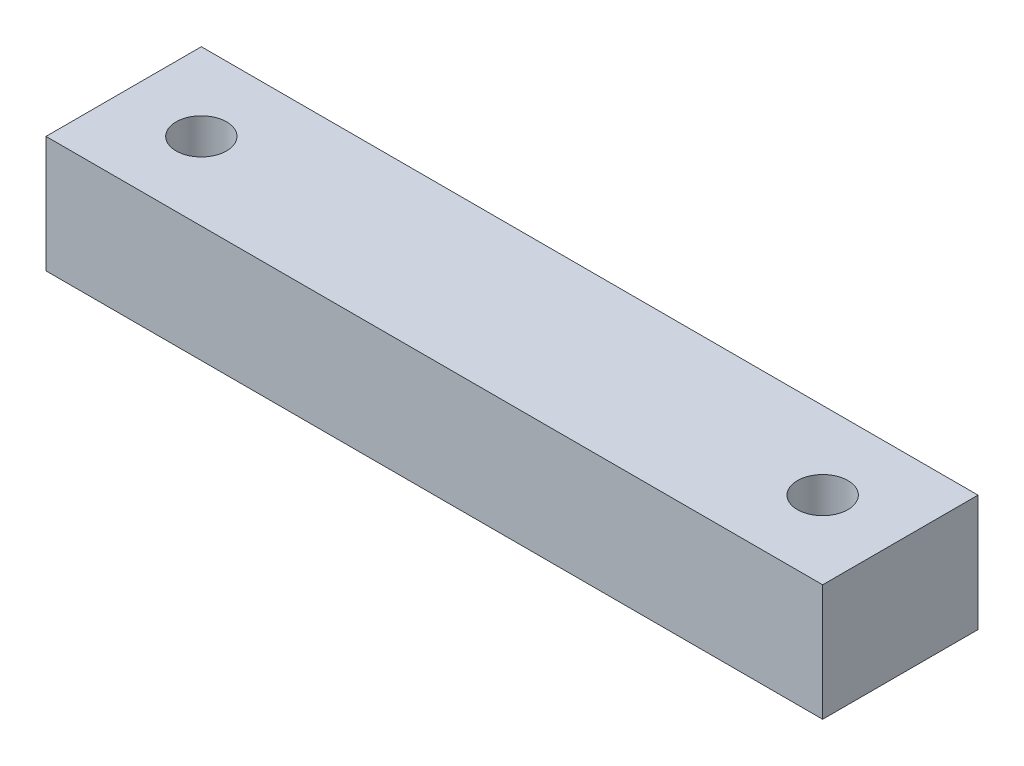
ISO-10303-21;
HEADER;
FILE_DESCRIPTION(('STEP AP214'),'2;1');
FILE_NAME('part.step','',(''),(''),'','','');
FILE_SCHEMA(('AUTOMOTIVE_DESIGN { 1 0 10303 214 1 1 1 1 }'));
ENDSEC;
DATA;
#1=APPLICATION_CONTEXT('core data for automotive mechanical design processes');
#2=APPLICATION_PROTOCOL_DEFINITION('international standard','automotive_design',2000,#1);
#3=PRODUCT_CONTEXT('',#1,'mechanical');
#4=PRODUCT('Part','Part','',(#3));
#5=PRODUCT_RELATED_PRODUCT_CATEGORY('part','',(#4));
#6=PRODUCT_DEFINITION_FORMATION('','',#4);
#7=PRODUCT_DEFINITION_CONTEXT('part definition',#1,'design');
#8=PRODUCT_DEFINITION('design','',#6,#7);
#9=PRODUCT_DEFINITION_SHAPE('','',#8);
#10=(LENGTH_UNIT() NAMED_UNIT(*) SI_UNIT(.MILLI.,.METRE.));
#11=(NAMED_UNIT(*) PLANE_ANGLE_UNIT() SI_UNIT($,.RADIAN.));
#12=(NAMED_UNIT(*) SI_UNIT($,.STERADIAN.) SOLID_ANGLE_UNIT());
#13=UNCERTAINTY_MEASURE_WITH_UNIT(LENGTH_MEASURE(1.E-05),#10,'distance_accuracy_value','');
#14=(GEOMETRIC_REPRESENTATION_CONTEXT(3) GLOBAL_UNCERTAINTY_ASSIGNED_CONTEXT((#13)) GLOBAL_UNIT_ASSIGNED_CONTEXT((#10,
#11,#12)) REPRESENTATION_CONTEXT('',''));
#15=CARTESIAN_POINT('',(0.,0.,0.));
#16=DIRECTION('',(0.,0.,1.));
#17=DIRECTION('',(1.,0.,0.));
#18=AXIS2_PLACEMENT_3D('',#15,#16,#17);
#19=CARTESIAN_POINT('',(0.,15.,0.));
#20=DIRECTION('',(1.,0.,0.));
#21=DIRECTION('',(0.,0.,-1.));
#22=AXIS2_PLACEMENT_3D('',#19,#20,#21);
#23=PLANE('',#22);
#24=DIRECTION('',(0.,0.,1.));
#25=VECTOR('',#24,1.);
#26=CARTESIAN_POINT('',(0.,0.,0.));
#27=LINE('',#26,#25);
#28=CARTESIAN_POINT('',(0.,0.,-20.));
#29=VERTEX_POINT('',#28);
#30=CARTESIAN_POINT('',(0.,0.,0.));
#31=VERTEX_POINT('',#30);
#32=EDGE_CURVE('E94',#29,#31,#27,.T.);
#33=ORIENTED_EDGE('',*,*,#32,.T.);
#34=DIRECTION('',(0.,-1.,0.));
#35=VECTOR('',#34,1.);
#36=CARTESIAN_POINT('',(0.,15.,0.));
#37=LINE('',#36,#35);
#38=CARTESIAN_POINT('',(0.,15.,0.));
#39=VERTEX_POINT('',#38);
#40=EDGE_CURVE('E11',#39,#31,#37,.T.);
#41=ORIENTED_EDGE('',*,*,#40,.F.);
#42=DIRECTION('',(0.,0.,1.));
#43=VECTOR('',#42,1.);
#44=CARTESIAN_POINT('',(0.,15.,0.));
#45=LINE('',#44,#43);
#46=CARTESIAN_POINT('',(0.,15.,-20.));
#47=VERTEX_POINT('',#46);
#48=EDGE_CURVE('E82',#47,#39,#45,.T.);
#49=ORIENTED_EDGE('',*,*,#48,.F.);
#50=DIRECTION('',(0.,-1.,0.));
#51=VECTOR('',#50,1.);
#52=CARTESIAN_POINT('',(0.,15.,-20.));
#53=LINE('',#52,#51);
#54=EDGE_CURVE('E90',#47,#29,#53,.T.);
#55=ORIENTED_EDGE('',*,*,#54,.T.);
#56=EDGE_LOOP('',(#33,#41,#49,#55));
#57=FACE_BOUND('',#56,.T.);
#58=ADVANCED_FACE('F31',(#57),#23,.F.);
#59=CARTESIAN_POINT('',(0.,15.,0.));
#60=DIRECTION('',(0.,0.,-1.));
#61=DIRECTION('',(-1.,0.,0.));
#62=AXIS2_PLACEMENT_3D('',#59,#60,#61);
#63=PLANE('',#62);
#64=DIRECTION('',(1.,0.,0.));
#65=VECTOR('',#64,1.);
#66=CARTESIAN_POINT('',(0.,0.,0.));
#67=LINE('',#66,#65);
#68=CARTESIAN_POINT('',(100.,0.,0.));
#69=VERTEX_POINT('',#68);
#70=EDGE_CURVE('E86',#31,#69,#67,.T.);
#71=ORIENTED_EDGE('',*,*,#70,.T.);
#72=DIRECTION('',(0.,-1.,0.));
#73=VECTOR('',#72,1.);
#74=CARTESIAN_POINT('',(100.,15.,0.));
#75=LINE('',#74,#73);
#76=CARTESIAN_POINT('',(100.,15.,0.));
#77=VERTEX_POINT('',#76);
#78=EDGE_CURVE('E39',#77,#69,#75,.T.);
#79=ORIENTED_EDGE('',*,*,#78,.F.);
#80=DIRECTION('',(1.,0.,0.));
#81=VECTOR('',#80,1.);
#82=CARTESIAN_POINT('',(0.,15.,0.));
#83=LINE('',#82,#81);
#84=EDGE_CURVE('E77',#39,#77,#83,.T.);
#85=ORIENTED_EDGE('',*,*,#84,.F.);
#86=ORIENTED_EDGE('',*,*,#40,.T.);
#87=EDGE_LOOP('',(#71,#79,#85,#86));
#88=FACE_BOUND('',#87,.T.);
#89=ADVANCED_FACE('F85',(#88),#63,.F.);
#90=CARTESIAN_POINT('',(100.,15.,0.));
#91=DIRECTION('',(-1.,0.,0.));
#92=DIRECTION('',(0.,0.,1.));
#93=AXIS2_PLACEMENT_3D('',#90,#91,#92);
#94=PLANE('',#93);
#95=DIRECTION('',(0.,0.,-1.));
#96=VECTOR('',#95,1.);
#97=CARTESIAN_POINT('',(100.,0.,0.));
#98=LINE('',#97,#96);
#99=CARTESIAN_POINT('',(100.,0.,-20.));
#100=VERTEX_POINT('',#99);
#101=EDGE_CURVE('E64',#69,#100,#98,.T.);
#102=ORIENTED_EDGE('',*,*,#101,.T.);
#103=DIRECTION('',(0.,-1.,0.));
#104=VECTOR('',#103,1.);
#105=CARTESIAN_POINT('',(100.,15.,-20.));
#106=LINE('',#105,#104);
#107=CARTESIAN_POINT('',(100.,15.,-20.));
#108=VERTEX_POINT('',#107);
#109=EDGE_CURVE('E87',#108,#100,#106,.T.);
#110=ORIENTED_EDGE('',*,*,#109,.F.);
#111=DIRECTION('',(0.,0.,-1.));
#112=VECTOR('',#111,1.);
#113=CARTESIAN_POINT('',(100.,15.,0.));
#114=LINE('',#113,#112);
#115=EDGE_CURVE('E80',#77,#108,#114,.T.);
#116=ORIENTED_EDGE('',*,*,#115,.F.);
#117=ORIENTED_EDGE('',*,*,#78,.T.);
#118=EDGE_LOOP('',(#102,#110,#116,#117));
#119=FACE_BOUND('',#118,.T.);
#120=ADVANCED_FACE('F88',(#119),#94,.F.);
#121=CARTESIAN_POINT('',(0.,15.,-20.));
#122=DIRECTION('',(0.,0.,1.));
#123=DIRECTION('',(1.,0.,0.));
#124=AXIS2_PLACEMENT_3D('',#121,#122,#123);
#125=PLANE('',#124);
#126=DIRECTION('',(-1.,0.,0.));
#127=VECTOR('',#126,1.);
#128=CARTESIAN_POINT('',(0.,0.,-20.));
#129=LINE('',#128,#127);
#130=EDGE_CURVE('E70',#100,#29,#129,.T.);
#131=ORIENTED_EDGE('',*,*,#130,.T.);
#132=ORIENTED_EDGE('',*,*,#54,.F.);
#133=DIRECTION('',(-1.,0.,0.));
#134=VECTOR('',#133,1.);
#135=CARTESIAN_POINT('',(0.,15.,-20.));
#136=LINE('',#135,#134);
#137=EDGE_CURVE('E47',#108,#47,#136,.T.);
#138=ORIENTED_EDGE('',*,*,#137,.F.);
#139=ORIENTED_EDGE('',*,*,#109,.T.);
#140=EDGE_LOOP('',(#131,#132,#138,#139));
#141=FACE_BOUND('',#140,.T.);
#142=ADVANCED_FACE('F102',(#141),#125,.F.);
#143=CARTESIAN_POINT('',(0.,15.,-20.));
#144=DIRECTION('',(0.,-1.,0.));
#145=DIRECTION('',(0.,0.,-1.));
#146=AXIS2_PLACEMENT_3D('',#143,#144,#145);
#147=PLANE('',#146);
#148=CARTESIAN_POINT('',(90.,15.,-10.));
#149=DIRECTION('',(0.,-1.,0.));
#150=DIRECTION('',(0.,0.,-1.));
#151=AXIS2_PLACEMENT_3D('',#148,#149,#150);
#152=CIRCLE('',#151,3.25000000000001);
#153=CARTESIAN_POINT('',(90.,15.,-13.25));
#154=VERTEX_POINT('',#153);
#155=EDGE_CURVE('E123',#154,#154,#152,.T.);
#156=ORIENTED_EDGE('',*,*,#155,.T.);
#157=EDGE_LOOP('',(#156));
#158=FACE_BOUND('',#157,.T.);
#159=CARTESIAN_POINT('',(10.,15.,-10.));
#160=DIRECTION('',(0.,-1.,0.));
#161=DIRECTION('',(0.,0.,-1.));
#162=AXIS2_PLACEMENT_3D('',#159,#160,#161);
#163=CIRCLE('',#162,3.25);
#164=CARTESIAN_POINT('',(10.,15.,-13.25));
#165=VERTEX_POINT('',#164);
#166=EDGE_CURVE('E117',#165,#165,#163,.T.);
#167=ORIENTED_EDGE('',*,*,#166,.T.);
#168=EDGE_LOOP('',(#167));
#169=FACE_BOUND('',#168,.T.);
#170=ORIENTED_EDGE('',*,*,#48,.T.);
#171=ORIENTED_EDGE('',*,*,#84,.T.);
#172=ORIENTED_EDGE('',*,*,#115,.T.);
#173=ORIENTED_EDGE('',*,*,#137,.T.);
#174=EDGE_LOOP('',(#170,#171,#172,#173));
#175=FACE_BOUND('',#174,.T.);
#176=ADVANCED_FACE('F78',(#158,#169,#175),#147,.F.);
#177=CARTESIAN_POINT('',(0.,0.,-20.));
#178=DIRECTION('',(0.,-1.,0.));
#179=DIRECTION('',(0.,0.,-1.));
#180=AXIS2_PLACEMENT_3D('',#177,#178,#179);
#181=PLANE('',#180);
#182=CARTESIAN_POINT('',(90.,0.,-10.));
#183=DIRECTION('',(0.,-1.,0.));
#184=DIRECTION('',(0.,0.,-1.));
#185=AXIS2_PLACEMENT_3D('',#182,#183,#184);
#186=CIRCLE('',#185,7.50000000000001);
#187=CARTESIAN_POINT('',(90.,0.,-17.5));
#188=VERTEX_POINT('',#187);
#189=EDGE_CURVE('E114',#188,#188,#186,.T.);
#190=ORIENTED_EDGE('',*,*,#189,.F.);
#191=EDGE_LOOP('',(#190));
#192=FACE_BOUND('',#191,.T.);
#193=CARTESIAN_POINT('',(10.,0.,-10.));
#194=DIRECTION('',(0.,-1.,0.));
#195=DIRECTION('',(0.,0.,-1.));
#196=AXIS2_PLACEMENT_3D('',#193,#194,#195);
#197=CIRCLE('',#196,7.5);
#198=CARTESIAN_POINT('',(10.,0.,-17.5));
#199=VERTEX_POINT('',#198);
#200=EDGE_CURVE('E108',#199,#199,#197,.T.);
#201=ORIENTED_EDGE('',*,*,#200,.F.);
#202=EDGE_LOOP('',(#201));
#203=FACE_BOUND('',#202,.T.);
#204=ORIENTED_EDGE('',*,*,#32,.F.);
#205=ORIENTED_EDGE('',*,*,#130,.F.);
#206=ORIENTED_EDGE('',*,*,#101,.F.);
#207=ORIENTED_EDGE('',*,*,#70,.F.);
#208=EDGE_LOOP('',(#204,#205,#206,#207));
#209=FACE_BOUND('',#208,.T.);
#210=ADVANCED_FACE('F105',(#192,#203,#209),#181,.T.);
#211=CARTESIAN_POINT('',(10.,6.,-10.));
#212=DIRECTION('',(0.,-1.,0.));
#213=DIRECTION('',(0.,0.,-1.));
#214=AXIS2_PLACEMENT_3D('',#211,#212,#213);
#215=CYLINDRICAL_SURFACE('',#214,7.5);
#216=CARTESIAN_POINT('',(10.,6.,-10.));
#217=DIRECTION('',(0.,-1.,0.));
#218=DIRECTION('',(0.,0.,-1.));
#219=AXIS2_PLACEMENT_3D('',#216,#217,#218);
#220=CIRCLE('',#219,7.5);
#221=CARTESIAN_POINT('',(10.,6.,-17.5));
#222=VERTEX_POINT('',#221);
#223=EDGE_CURVE('E97',#222,#222,#220,.T.);
#224=ORIENTED_EDGE('',*,*,#223,.F.);
#225=EDGE_LOOP('',(#224));
#226=FACE_BOUND('',#225,.T.);
#227=ORIENTED_EDGE('',*,*,#200,.T.);
#228=EDGE_LOOP('',(#227));
#229=FACE_BOUND('',#228,.T.);
#230=ADVANCED_FACE('F156',(#226,#229),#215,.F.);
#231=CARTESIAN_POINT('',(10.,6.,-10.));
#232=DIRECTION('',(0.,-1.,0.));
#233=DIRECTION('',(0.,0.,-1.));
#234=AXIS2_PLACEMENT_3D('',#231,#232,#233);
#235=PLANE('',#234);
#236=CARTESIAN_POINT('',(10.,6.,-10.));
#237=DIRECTION('',(0.,-1.,0.));
#238=DIRECTION('',(0.,0.,-1.));
#239=AXIS2_PLACEMENT_3D('',#236,#237,#238);
#240=CIRCLE('',#239,3.25);
#241=CARTESIAN_POINT('',(10.,6.,-13.25));
#242=VERTEX_POINT('',#241);
#243=EDGE_CURVE('E120',#242,#242,#240,.T.);
#244=ORIENTED_EDGE('',*,*,#243,.F.);
#245=EDGE_LOOP('',(#244));
#246=FACE_BOUND('',#245,.T.);
#247=ORIENTED_EDGE('',*,*,#223,.T.);
#248=EDGE_LOOP('',(#247));
#249=FACE_BOUND('',#248,.T.);
#250=ADVANCED_FACE('F150',(#246,#249),#235,.T.);
#251=CARTESIAN_POINT('',(90.,6.,-10.));
#252=DIRECTION('',(0.,-1.,0.));
#253=DIRECTION('',(0.,0.,-1.));
#254=AXIS2_PLACEMENT_3D('',#251,#252,#253);
#255=CYLINDRICAL_SURFACE('',#254,7.50000000000001);
#256=CARTESIAN_POINT('',(90.,6.,-10.));
#257=DIRECTION('',(0.,-1.,0.));
#258=DIRECTION('',(0.,0.,-1.));
#259=AXIS2_PLACEMENT_3D('',#256,#257,#258);
#260=CIRCLE('',#259,7.50000000000001);
#261=CARTESIAN_POINT('',(90.,6.,-17.5));
#262=VERTEX_POINT('',#261);
#263=EDGE_CURVE('E111',#262,#262,#260,.T.);
#264=ORIENTED_EDGE('',*,*,#263,.F.);
#265=EDGE_LOOP('',(#264));
#266=FACE_BOUND('',#265,.T.);
#267=ORIENTED_EDGE('',*,*,#189,.T.);
#268=EDGE_LOOP('',(#267));
#269=FACE_BOUND('',#268,.T.);
#270=ADVANCED_FACE('F144',(#266,#269),#255,.F.);
#271=CARTESIAN_POINT('',(90.,6.,-10.));
#272=DIRECTION('',(0.,-1.,0.));
#273=DIRECTION('',(0.,0.,-1.));
#274=AXIS2_PLACEMENT_3D('',#271,#272,#273);
#275=PLANE('',#274);
#276=CARTESIAN_POINT('',(90.,6.,-10.));
#277=DIRECTION('',(0.,-1.,0.));
#278=DIRECTION('',(0.,0.,-1.));
#279=AXIS2_PLACEMENT_3D('',#276,#277,#278);
#280=CIRCLE('',#279,3.25000000000001);
#281=CARTESIAN_POINT('',(90.,6.,-13.25));
#282=VERTEX_POINT('',#281);
#283=EDGE_CURVE('E126',#282,#282,#280,.T.);
#284=ORIENTED_EDGE('',*,*,#283,.F.);
#285=EDGE_LOOP('',(#284));
#286=FACE_BOUND('',#285,.T.);
#287=ORIENTED_EDGE('',*,*,#263,.T.);
#288=EDGE_LOOP('',(#287));
#289=FACE_BOUND('',#288,.T.);
#290=ADVANCED_FACE('F141',(#286,#289),#275,.T.);
#291=CARTESIAN_POINT('',(10.,15.,-10.));
#292=DIRECTION('',(0.,-1.,0.));
#293=DIRECTION('',(0.,0.,-1.));
#294=AXIS2_PLACEMENT_3D('',#291,#292,#293);
#295=CYLINDRICAL_SURFACE('',#294,3.25);
#296=ORIENTED_EDGE('',*,*,#166,.F.);
#297=EDGE_LOOP('',(#296));
#298=FACE_BOUND('',#297,.T.);
#299=ORIENTED_EDGE('',*,*,#243,.T.);
#300=EDGE_LOOP('',(#299));
#301=FACE_BOUND('',#300,.T.);
#302=ADVANCED_FACE('F137',(#298,#301),#295,.F.);
#303=CARTESIAN_POINT('',(90.,15.,-10.));
#304=DIRECTION('',(0.,-1.,0.));
#305=DIRECTION('',(0.,0.,-1.));
#306=AXIS2_PLACEMENT_3D('',#303,#304,#305);
#307=CYLINDRICAL_SURFACE('',#306,3.25000000000001);
#308=ORIENTED_EDGE('',*,*,#155,.F.);
#309=EDGE_LOOP('',(#308));
#310=FACE_BOUND('',#309,.T.);
#311=ORIENTED_EDGE('',*,*,#283,.T.);
#312=EDGE_LOOP('',(#311));
#313=FACE_BOUND('',#312,.T.);
#314=ADVANCED_FACE('F134',(#310,#313),#307,.F.);
#315=CLOSED_SHELL('',(#58,#89,#120,#142,#176,#210,#230,#250,#270,#290,#302,#314));
#316=MANIFOLD_SOLID_BREP('B2',#315);
#317=ADVANCED_BREP_SHAPE_REPRESENTATION('',(#18,#316),#14);
#318=SHAPE_DEFINITION_REPRESENTATION(#9,#317);
ENDSEC;
END-ISO-10303-21;
